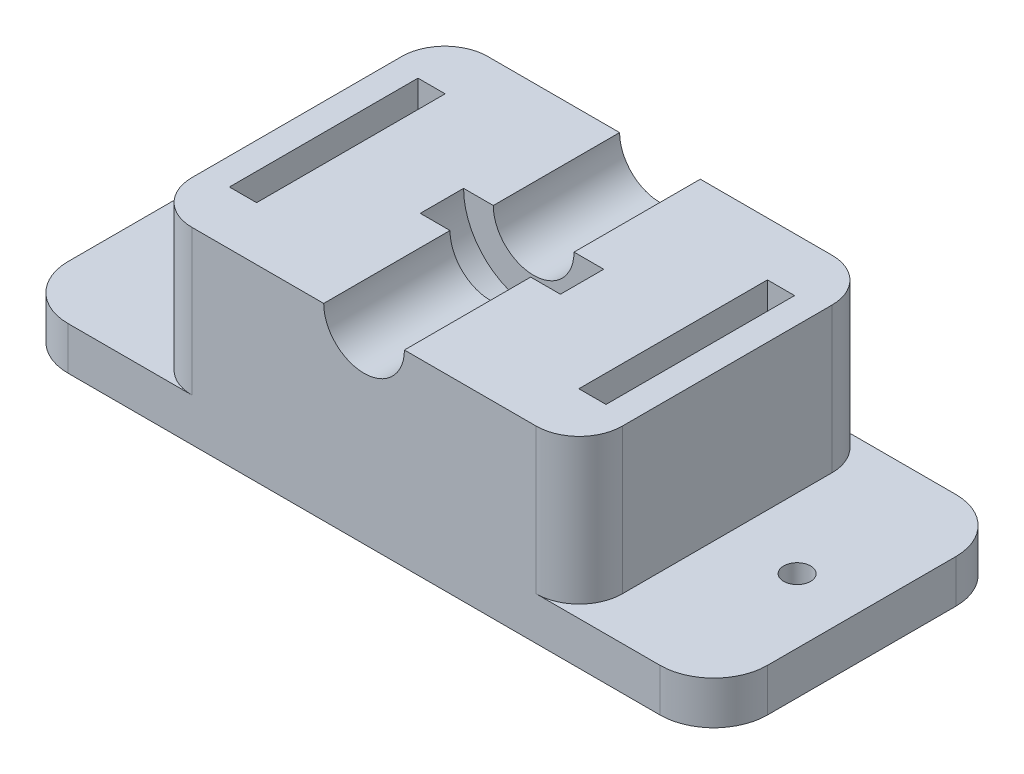
ISO-10303-21;
HEADER;
FILE_DESCRIPTION(('STEP AP214'),'2;1');
FILE_NAME('part.step','',(''),(''),'','','');
FILE_SCHEMA(('AUTOMOTIVE_DESIGN { 1 0 10303 214 1 1 1 1 }'));
ENDSEC;
DATA;
#1=APPLICATION_CONTEXT('core data for automotive mechanical design processes');
#2=APPLICATION_PROTOCOL_DEFINITION('international standard','automotive_design',2000,#1);
#3=PRODUCT_CONTEXT('',#1,'mechanical');
#4=PRODUCT('Part','Part','',(#3));
#5=PRODUCT_RELATED_PRODUCT_CATEGORY('part','',(#4));
#6=PRODUCT_DEFINITION_FORMATION('','',#4);
#7=PRODUCT_DEFINITION_CONTEXT('part definition',#1,'design');
#8=PRODUCT_DEFINITION('design','',#6,#7);
#9=PRODUCT_DEFINITION_SHAPE('','',#8);
#10=(LENGTH_UNIT() NAMED_UNIT(*) SI_UNIT(.MILLI.,.METRE.));
#11=(NAMED_UNIT(*) PLANE_ANGLE_UNIT() SI_UNIT($,.RADIAN.));
#12=(NAMED_UNIT(*) SI_UNIT($,.STERADIAN.) SOLID_ANGLE_UNIT());
#13=UNCERTAINTY_MEASURE_WITH_UNIT(LENGTH_MEASURE(1.E-05),#10,'distance_accuracy_value','');
#14=(GEOMETRIC_REPRESENTATION_CONTEXT(3) GLOBAL_UNCERTAINTY_ASSIGNED_CONTEXT((#13)) GLOBAL_UNIT_ASSIGNED_CONTEXT((#10,
#11,#12)) REPRESENTATION_CONTEXT('',''));
#15=CARTESIAN_POINT('',(0.,0.,0.));
#16=DIRECTION('',(0.,0.,1.));
#17=DIRECTION('',(1.,0.,0.));
#18=AXIS2_PLACEMENT_3D('',#15,#16,#17);
#19=CARTESIAN_POINT('',(-40.,0.,55.));
#20=DIRECTION('',(0.,-1.,0.));
#21=DIRECTION('',(0.,0.,-1.));
#22=AXIS2_PLACEMENT_3D('',#19,#20,#21);
#23=PLANE('',#22);
#24=DIRECTION('',(-1.,0.,0.));
#25=VECTOR('',#24,1.);
#26=CARTESIAN_POINT('',(35.,0.,9.97499999999998));
#27=LINE('',#26,#25);
#28=CARTESIAN_POINT('',(35.,0.,9.97499999999998));
#29=VERTEX_POINT('',#28);
#30=CARTESIAN_POINT('',(29.95,0.,9.97499999999998));
#31=VERTEX_POINT('',#30);
#32=EDGE_CURVE('E352',#29,#31,#27,.T.);
#33=ORIENTED_EDGE('',*,*,#32,.F.);
#34=DIRECTION('',(0.,0.,-1.));
#35=VECTOR('',#34,1.);
#36=CARTESIAN_POINT('',(35.,0.,9.97499999999998));
#37=LINE('',#36,#35);
#38=CARTESIAN_POINT('',(35.,0.,45.025));
#39=VERTEX_POINT('',#38);
#40=EDGE_CURVE('E262',#39,#29,#37,.T.);
#41=ORIENTED_EDGE('',*,*,#40,.F.);
#42=DIRECTION('',(1.,0.,0.));
#43=VECTOR('',#42,1.);
#44=CARTESIAN_POINT('',(35.,0.,45.025));
#45=LINE('',#44,#43);
#46=CARTESIAN_POINT('',(29.95,0.,45.025));
#47=VERTEX_POINT('',#46);
#48=EDGE_CURVE('E337',#47,#39,#45,.T.);
#49=ORIENTED_EDGE('',*,*,#48,.F.);
#50=DIRECTION('',(0.,0.,1.));
#51=VECTOR('',#50,1.);
#52=CARTESIAN_POINT('',(29.95,0.,9.97499999999998));
#53=LINE('',#52,#51);
#54=EDGE_CURVE('E356',#31,#47,#53,.T.);
#55=ORIENTED_EDGE('',*,*,#54,.F.);
#56=EDGE_LOOP('',(#33,#41,#49,#55));
#57=FACE_BOUND('',#56,.T.);
#58=DIRECTION('',(0.,0.,-1.));
#59=VECTOR('',#58,1.);
#60=CARTESIAN_POINT('',(40.,0.,55.));
#61=LINE('',#60,#59);
#62=CARTESIAN_POINT('',(40.,0.,47.));
#63=VERTEX_POINT('',#62);
#64=CARTESIAN_POINT('',(40.,0.,8.));
#65=VERTEX_POINT('',#64);
#66=EDGE_CURVE('E415',#63,#65,#61,.T.);
#67=ORIENTED_EDGE('',*,*,#66,.T.);
#68=CARTESIAN_POINT('',(32.,0.,8.));
#69=DIRECTION('',(0.,-1.,0.));
#70=DIRECTION('',(0.,0.,-1.));
#71=AXIS2_PLACEMENT_3D('',#68,#69,#70);
#72=CIRCLE('',#71,8.);
#73=CARTESIAN_POINT('',(32.,0.,0.));
#74=VERTEX_POINT('',#73);
#75=EDGE_CURVE('E246',#65,#74,#72,.F.);
#76=ORIENTED_EDGE('',*,*,#75,.T.);
#77=DIRECTION('',(-1.,0.,0.));
#78=VECTOR('',#77,1.);
#79=CARTESIAN_POINT('',(-40.,0.,0.));
#80=LINE('',#79,#78);
#81=CARTESIAN_POINT('',(7.5,0.,0.));
#82=VERTEX_POINT('',#81);
#83=EDGE_CURVE('E240',#74,#82,#80,.T.);
#84=ORIENTED_EDGE('',*,*,#83,.T.);
#85=DIRECTION('',(0.,0.,1.));
#86=VECTOR('',#85,1.);
#87=CARTESIAN_POINT('',(7.5,0.,0.));
#88=LINE('',#87,#86);
#89=CARTESIAN_POINT('',(7.5,0.,23.475));
#90=VERTEX_POINT('',#89);
#91=EDGE_CURVE('E244',#82,#90,#88,.T.);
#92=ORIENTED_EDGE('',*,*,#91,.T.);
#93=DIRECTION('',(-1.,0.,0.));
#94=VECTOR('',#93,1.);
#95=CARTESIAN_POINT('',(-40.,0.,23.475));
#96=LINE('',#95,#94);
#97=CARTESIAN_POINT('',(13.025,0.,23.475));
#98=VERTEX_POINT('',#97);
#99=EDGE_CURVE('E448',#98,#90,#96,.T.);
#100=ORIENTED_EDGE('',*,*,#99,.F.);
#101=DIRECTION('',(0.,0.,1.));
#102=VECTOR('',#101,1.);
#103=CARTESIAN_POINT('',(13.025,0.,23.475));
#104=LINE('',#103,#102);
#105=CARTESIAN_POINT('',(13.025,0.,31.525));
#106=VERTEX_POINT('',#105);
#107=EDGE_CURVE('E443',#98,#106,#104,.T.);
#108=ORIENTED_EDGE('',*,*,#107,.T.);
#109=DIRECTION('',(-1.,0.,0.));
#110=VECTOR('',#109,1.);
#111=CARTESIAN_POINT('',(-40.,0.,31.525));
#112=LINE('',#111,#110);
#113=CARTESIAN_POINT('',(7.5,0.,31.525));
#114=VERTEX_POINT('',#113);
#115=EDGE_CURVE('E435',#106,#114,#112,.T.);
#116=ORIENTED_EDGE('',*,*,#115,.T.);
#117=CARTESIAN_POINT('',(7.5,0.,55.));
#118=VERTEX_POINT('',#117);
#119=EDGE_CURVE('E265',#114,#118,#88,.T.);
#120=ORIENTED_EDGE('',*,*,#119,.T.);
#121=DIRECTION('',(-1.,0.,0.));
#122=VECTOR('',#121,1.);
#123=CARTESIAN_POINT('',(-40.,0.,55.));
#124=LINE('',#123,#122);
#125=CARTESIAN_POINT('',(32.,0.,55.));
#126=VERTEX_POINT('',#125);
#127=EDGE_CURVE('E389',#126,#118,#124,.T.);
#128=ORIENTED_EDGE('',*,*,#127,.F.);
#129=CARTESIAN_POINT('',(32.,0.,47.));
#130=DIRECTION('',(0.,-1.,0.));
#131=DIRECTION('',(0.,0.,-1.));
#132=AXIS2_PLACEMENT_3D('',#129,#130,#131);
#133=CIRCLE('',#132,8.);
#134=EDGE_CURVE('E532',#126,#63,#133,.F.);
#135=ORIENTED_EDGE('',*,*,#134,.T.);
#136=EDGE_LOOP('',(#67,#76,#84,#92,#100,#108,#116,#120,#128,#135));
#137=FACE_BOUND('',#136,.T.);
#138=ADVANCED_FACE('F41',(#57,#137),#23,.F.);
#139=DIRECTION('',(1.,0.,0.));
#140=VECTOR('',#139,1.);
#141=CARTESIAN_POINT('',(-35.,0.,45.025));
#142=LINE('',#141,#140);
#143=CARTESIAN_POINT('',(-35.,0.,45.025));
#144=VERTEX_POINT('',#143);
#145=CARTESIAN_POINT('',(-29.95,0.,45.025));
#146=VERTEX_POINT('',#145);
#147=EDGE_CURVE('E307',#144,#146,#142,.T.);
#148=ORIENTED_EDGE('',*,*,#147,.F.);
#149=DIRECTION('',(0.,0.,1.));
#150=VECTOR('',#149,1.);
#151=CARTESIAN_POINT('',(-35.,0.,9.97500000000001));
#152=LINE('',#151,#150);
#153=CARTESIAN_POINT('',(-35.,0.,9.97500000000001));
#154=VERTEX_POINT('',#153);
#155=EDGE_CURVE('E304',#154,#144,#152,.T.);
#156=ORIENTED_EDGE('',*,*,#155,.F.);
#157=DIRECTION('',(-1.,0.,0.));
#158=VECTOR('',#157,1.);
#159=CARTESIAN_POINT('',(-35.,0.,9.97500000000001));
#160=LINE('',#159,#158);
#161=CARTESIAN_POINT('',(-29.95,0.,9.975));
#162=VERTEX_POINT('',#161);
#163=EDGE_CURVE('E291',#162,#154,#160,.T.);
#164=ORIENTED_EDGE('',*,*,#163,.F.);
#165=DIRECTION('',(0.,0.,-1.));
#166=VECTOR('',#165,1.);
#167=CARTESIAN_POINT('',(-29.95,0.,9.975));
#168=LINE('',#167,#166);
#169=EDGE_CURVE('E312',#146,#162,#168,.T.);
#170=ORIENTED_EDGE('',*,*,#169,.F.);
#171=EDGE_LOOP('',(#148,#156,#164,#170));
#172=FACE_BOUND('',#171,.T.);
#173=CARTESIAN_POINT('',(-7.5,0.,0.));
#174=VERTEX_POINT('',#173);
#175=CARTESIAN_POINT('',(-32.,0.,0.));
#176=VERTEX_POINT('',#175);
#177=EDGE_CURVE('E253',#174,#176,#80,.T.);
#178=ORIENTED_EDGE('',*,*,#177,.T.);
#179=CARTESIAN_POINT('',(-32.,0.,8.));
#180=DIRECTION('',(0.,-1.,0.));
#181=DIRECTION('',(0.,0.,-1.));
#182=AXIS2_PLACEMENT_3D('',#179,#180,#181);
#183=CIRCLE('',#182,8.);
#184=CARTESIAN_POINT('',(-40.,0.,8.));
#185=VERTEX_POINT('',#184);
#186=EDGE_CURVE('E522',#176,#185,#183,.F.);
#187=ORIENTED_EDGE('',*,*,#186,.T.);
#188=DIRECTION('',(0.,0.,-1.));
#189=VECTOR('',#188,1.);
#190=CARTESIAN_POINT('',(-40.,0.,55.));
#191=LINE('',#190,#189);
#192=CARTESIAN_POINT('',(-40.,0.,47.));
#193=VERTEX_POINT('',#192);
#194=EDGE_CURVE('E411',#193,#185,#191,.T.);
#195=ORIENTED_EDGE('',*,*,#194,.F.);
#196=CARTESIAN_POINT('',(-32.,0.,47.));
#197=DIRECTION('',(0.,-1.,0.));
#198=DIRECTION('',(0.,0.,-1.));
#199=AXIS2_PLACEMENT_3D('',#196,#197,#198);
#200=CIRCLE('',#199,8.);
#201=CARTESIAN_POINT('',(-32.,0.,55.));
#202=VERTEX_POINT('',#201);
#203=EDGE_CURVE('E519',#193,#202,#200,.F.);
#204=ORIENTED_EDGE('',*,*,#203,.T.);
#205=CARTESIAN_POINT('',(-7.5,0.,55.));
#206=VERTEX_POINT('',#205);
#207=EDGE_CURVE('E388',#206,#202,#124,.T.);
#208=ORIENTED_EDGE('',*,*,#207,.F.);
#209=DIRECTION('',(0.,0.,1.));
#210=VECTOR('',#209,1.);
#211=CARTESIAN_POINT('',(-7.5,0.,0.));
#212=LINE('',#211,#210);
#213=CARTESIAN_POINT('',(-7.5,0.,31.525));
#214=VERTEX_POINT('',#213);
#215=EDGE_CURVE('E270',#206,#214,#212,.F.);
#216=ORIENTED_EDGE('',*,*,#215,.T.);
#217=CARTESIAN_POINT('',(-13.025,0.,31.525));
#218=VERTEX_POINT('',#217);
#219=EDGE_CURVE('E434',#214,#218,#112,.T.);
#220=ORIENTED_EDGE('',*,*,#219,.T.);
#221=DIRECTION('',(0.,0.,1.));
#222=VECTOR('',#221,1.);
#223=CARTESIAN_POINT('',(-13.025,0.,23.475));
#224=LINE('',#223,#222);
#225=CARTESIAN_POINT('',(-13.025,0.,23.475));
#226=VERTEX_POINT('',#225);
#227=EDGE_CURVE('E439',#218,#226,#224,.F.);
#228=ORIENTED_EDGE('',*,*,#227,.T.);
#229=CARTESIAN_POINT('',(-7.5,0.,23.475));
#230=VERTEX_POINT('',#229);
#231=EDGE_CURVE('E447',#230,#226,#96,.T.);
#232=ORIENTED_EDGE('',*,*,#231,.F.);
#233=EDGE_CURVE('E263',#230,#174,#212,.F.);
#234=ORIENTED_EDGE('',*,*,#233,.T.);
#235=EDGE_LOOP('',(#178,#187,#195,#204,#208,#216,#220,#228,#232,#234));
#236=FACE_BOUND('',#235,.T.);
#237=ADVANCED_FACE('F577',(#172,#236),#23,.F.);
#238=CARTESIAN_POINT('',(-65.,-35.,55.));
#239=DIRECTION('',(1.,0.,0.));
#240=DIRECTION('',(0.,0.,-1.));
#241=AXIS2_PLACEMENT_3D('',#238,#239,#240);
#242=PLANE('',#241);
#243=DIRECTION('',(0.,0.,-1.));
#244=VECTOR('',#243,1.);
#245=CARTESIAN_POINT('',(-65.,-27.,55.));
#246=LINE('',#245,#244);
#247=CARTESIAN_POINT('',(-65.,-27.,45.));
#248=VERTEX_POINT('',#247);
#249=CARTESIAN_POINT('',(-65.,-27.,10.));
#250=VERTEX_POINT('',#249);
#251=EDGE_CURVE('E394',#248,#250,#246,.T.);
#252=ORIENTED_EDGE('',*,*,#251,.T.);
#253=DIRECTION('',(0.,-1.,0.));
#254=VECTOR('',#253,1.);
#255=CARTESIAN_POINT('',(-65.,-35.,10.));
#256=LINE('',#255,#254);
#257=CARTESIAN_POINT('',(-65.,-35.,10.));
#258=VERTEX_POINT('',#257);
#259=EDGE_CURVE('E496',#250,#258,#256,.T.);
#260=ORIENTED_EDGE('',*,*,#259,.T.);
#261=DIRECTION('',(0.,0.,-1.));
#262=VECTOR('',#261,1.);
#263=CARTESIAN_POINT('',(-65.,-35.,55.));
#264=LINE('',#263,#262);
#265=CARTESIAN_POINT('',(-65.,-35.,45.));
#266=VERTEX_POINT('',#265);
#267=EDGE_CURVE('E430',#266,#258,#264,.T.);
#268=ORIENTED_EDGE('',*,*,#267,.F.);
#269=DIRECTION('',(0.,-1.,0.));
#270=VECTOR('',#269,1.);
#271=CARTESIAN_POINT('',(-65.,-27.,45.));
#272=LINE('',#271,#270);
#273=EDGE_CURVE('E493',#266,#248,#272,.F.);
#274=ORIENTED_EDGE('',*,*,#273,.T.);
#275=EDGE_LOOP('',(#252,#260,#268,#274));
#276=FACE_BOUND('',#275,.T.);
#277=ADVANCED_FACE('F600',(#276),#242,.F.);
#278=CARTESIAN_POINT('',(40.,-35.,55.));
#279=DIRECTION('',(0.,1.,0.));
#280=DIRECTION('',(0.,0.,1.));
#281=AXIS2_PLACEMENT_3D('',#278,#279,#280);
#282=PLANE('',#281);
#283=CARTESIAN_POINT('',(-53.,-35.,27.5));
#284=DIRECTION('',(0.,1.,0.));
#285=DIRECTION('',(0.,0.,1.));
#286=AXIS2_PLACEMENT_3D('',#283,#284,#285);
#287=CIRCLE('',#286,2.5);
#288=CARTESIAN_POINT('',(-53.,-35.,30.));
#289=VERTEX_POINT('',#288);
#290=EDGE_CURVE('E278',#289,#289,#287,.T.);
#291=ORIENTED_EDGE('',*,*,#290,.T.);
#292=EDGE_LOOP('',(#291));
#293=FACE_BOUND('',#292,.T.);
#294=CARTESIAN_POINT('',(53.,-35.,27.5));
#295=DIRECTION('',(0.,1.,0.));
#296=DIRECTION('',(0.,0.,-1.));
#297=AXIS2_PLACEMENT_3D('',#294,#295,#296);
#298=CIRCLE('',#297,2.5);
#299=CARTESIAN_POINT('',(53.,-35.,25.));
#300=VERTEX_POINT('',#299);
#301=EDGE_CURVE('E702',#300,#300,#298,.T.);
#302=ORIENTED_EDGE('',*,*,#301,.T.);
#303=EDGE_LOOP('',(#302));
#304=FACE_BOUND('',#303,.T.);
#305=DIRECTION('',(1.,0.,0.));
#306=VECTOR('',#305,1.);
#307=CARTESIAN_POINT('',(40.,-35.,0.));
#308=LINE('',#307,#306);
#309=CARTESIAN_POINT('',(-55.,-35.,0.));
#310=VERTEX_POINT('',#309);
#311=CARTESIAN_POINT('',(55.,-35.,0.));
#312=VERTEX_POINT('',#311);
#313=EDGE_CURVE('E378',#310,#312,#308,.T.);
#314=ORIENTED_EDGE('',*,*,#313,.T.);
#315=CARTESIAN_POINT('',(55.,-35.,10.));
#316=DIRECTION('',(0.,1.,0.));
#317=DIRECTION('',(0.,0.,1.));
#318=AXIS2_PLACEMENT_3D('',#315,#316,#317);
#319=CIRCLE('',#318,10.);
#320=CARTESIAN_POINT('',(65.,-35.,10.));
#321=VERTEX_POINT('',#320);
#322=EDGE_CURVE('E483',#312,#321,#319,.F.);
#323=ORIENTED_EDGE('',*,*,#322,.T.);
#324=DIRECTION('',(0.,0.,-1.));
#325=VECTOR('',#324,1.);
#326=CARTESIAN_POINT('',(65.,-35.,55.));
#327=LINE('',#326,#325);
#328=CARTESIAN_POINT('',(65.,-35.,45.));
#329=VERTEX_POINT('',#328);
#330=EDGE_CURVE('E426',#329,#321,#327,.T.);
#331=ORIENTED_EDGE('',*,*,#330,.F.);
#332=CARTESIAN_POINT('',(55.,-35.,45.));
#333=DIRECTION('',(0.,1.,0.));
#334=DIRECTION('',(0.,0.,1.));
#335=AXIS2_PLACEMENT_3D('',#332,#333,#334);
#336=CIRCLE('',#335,10.);
#337=CARTESIAN_POINT('',(55.,-35.,55.));
#338=VERTEX_POINT('',#337);
#339=EDGE_CURVE('E480',#329,#338,#336,.F.);
#340=ORIENTED_EDGE('',*,*,#339,.T.);
#341=DIRECTION('',(1.,0.,0.));
#342=VECTOR('',#341,1.);
#343=CARTESIAN_POINT('',(-40.,-35.,55.));
#344=LINE('',#343,#342);
#345=CARTESIAN_POINT('',(-55.,-35.,55.));
#346=VERTEX_POINT('',#345);
#347=EDGE_CURVE('E382',#346,#338,#344,.T.);
#348=ORIENTED_EDGE('',*,*,#347,.F.);
#349=CARTESIAN_POINT('',(-55.,-35.,45.));
#350=DIRECTION('',(0.,1.,0.));
#351=DIRECTION('',(0.,0.,1.));
#352=AXIS2_PLACEMENT_3D('',#349,#350,#351);
#353=CIRCLE('',#352,10.);
#354=EDGE_CURVE('E474',#346,#266,#353,.F.);
#355=ORIENTED_EDGE('',*,*,#354,.T.);
#356=ORIENTED_EDGE('',*,*,#267,.T.);
#357=CARTESIAN_POINT('',(-55.,-35.,10.));
#358=DIRECTION('',(0.,1.,0.));
#359=DIRECTION('',(0.,0.,1.));
#360=AXIS2_PLACEMENT_3D('',#357,#358,#359);
#361=CIRCLE('',#360,10.);
#362=EDGE_CURVE('E477',#258,#310,#361,.F.);
#363=ORIENTED_EDGE('',*,*,#362,.T.);
#364=EDGE_LOOP('',(#314,#323,#331,#340,#348,#355,#356,#363));
#365=FACE_BOUND('',#364,.T.);
#366=ADVANCED_FACE('F617',(#293,#304,#365),#282,.F.);
#367=CARTESIAN_POINT('',(65.,-35.,55.));
#368=DIRECTION('',(-1.,0.,0.));
#369=DIRECTION('',(0.,-1.,0.));
#370=AXIS2_PLACEMENT_3D('',#367,#368,#369);
#371=PLANE('',#370);
#372=ORIENTED_EDGE('',*,*,#330,.T.);
#373=DIRECTION('',(0.,1.,0.));
#374=VECTOR('',#373,1.);
#375=CARTESIAN_POINT('',(65.,-35.,10.));
#376=LINE('',#375,#374);
#377=CARTESIAN_POINT('',(65.,-27.,10.));
#378=VERTEX_POINT('',#377);
#379=EDGE_CURVE('E458',#321,#378,#376,.T.);
#380=ORIENTED_EDGE('',*,*,#379,.T.);
#381=DIRECTION('',(0.,0.,-1.));
#382=VECTOR('',#381,1.);
#383=CARTESIAN_POINT('',(65.,-27.,55.));
#384=LINE('',#383,#382);
#385=CARTESIAN_POINT('',(65.,-27.,45.));
#386=VERTEX_POINT('',#385);
#387=EDGE_CURVE('E422',#386,#378,#384,.T.);
#388=ORIENTED_EDGE('',*,*,#387,.F.);
#389=DIRECTION('',(0.,1.,0.));
#390=VECTOR('',#389,1.);
#391=CARTESIAN_POINT('',(65.,-35.,45.));
#392=LINE('',#391,#390);
#393=EDGE_CURVE('E455',#386,#329,#392,.F.);
#394=ORIENTED_EDGE('',*,*,#393,.T.);
#395=EDGE_LOOP('',(#372,#380,#388,#394));
#396=FACE_BOUND('',#395,.T.);
#397=ADVANCED_FACE('F613',(#396),#371,.F.);
#398=CARTESIAN_POINT('',(40.,-27.,55.));
#399=DIRECTION('',(0.,-1.,0.));
#400=DIRECTION('',(1.,0.,0.));
#401=AXIS2_PLACEMENT_3D('',#398,#399,#400);
#402=PLANE('',#401);
#403=CARTESIAN_POINT('',(53.,-27.,27.5));
#404=DIRECTION('',(0.,1.,0.));
#405=DIRECTION('',(0.,0.,-1.));
#406=AXIS2_PLACEMENT_3D('',#403,#404,#405);
#407=CIRCLE('',#406,2.5);
#408=CARTESIAN_POINT('',(53.,-27.,25.));
#409=VERTEX_POINT('',#408);
#410=EDGE_CURVE('E709',#409,#409,#407,.T.);
#411=ORIENTED_EDGE('',*,*,#410,.F.);
#412=EDGE_LOOP('',(#411));
#413=FACE_BOUND('',#412,.T.);
#414=ORIENTED_EDGE('',*,*,#387,.T.);
#415=CARTESIAN_POINT('',(55.,-27.,10.));
#416=DIRECTION('',(0.,-1.,0.));
#417=DIRECTION('',(1.,0.,0.));
#418=AXIS2_PLACEMENT_3D('',#415,#416,#417);
#419=CIRCLE('',#418,10.);
#420=CARTESIAN_POINT('',(55.,-27.,0.));
#421=VERTEX_POINT('',#420);
#422=EDGE_CURVE('E465',#378,#421,#419,.F.);
#423=ORIENTED_EDGE('',*,*,#422,.T.);
#424=DIRECTION('',(-1.,0.,0.));
#425=VECTOR('',#424,1.);
#426=CARTESIAN_POINT('',(40.,-27.,0.));
#427=LINE('',#426,#425);
#428=CARTESIAN_POINT('',(32.,-27.,0.));
#429=VERTEX_POINT('',#428);
#430=EDGE_CURVE('E398',#421,#429,#427,.T.);
#431=ORIENTED_EDGE('',*,*,#430,.T.);
#432=CARTESIAN_POINT('',(32.,-27.,8.));
#433=DIRECTION('',(0.,-1.,0.));
#434=DIRECTION('',(1.,0.,0.));
#435=AXIS2_PLACEMENT_3D('',#432,#433,#434);
#436=CIRCLE('',#435,8.);
#437=CARTESIAN_POINT('',(40.,-27.,8.));
#438=VERTEX_POINT('',#437);
#439=EDGE_CURVE('E548',#429,#438,#436,.T.);
#440=ORIENTED_EDGE('',*,*,#439,.T.);
#441=DIRECTION('',(0.,0.,-1.));
#442=VECTOR('',#441,1.);
#443=CARTESIAN_POINT('',(40.,-27.,55.));
#444=LINE('',#443,#442);
#445=CARTESIAN_POINT('',(40.,-27.,47.));
#446=VERTEX_POINT('',#445);
#447=EDGE_CURVE('E418',#446,#438,#444,.T.);
#448=ORIENTED_EDGE('',*,*,#447,.F.);
#449=CARTESIAN_POINT('',(32.,-27.,47.));
#450=DIRECTION('',(0.,-1.,0.));
#451=DIRECTION('',(1.,0.,0.));
#452=AXIS2_PLACEMENT_3D('',#449,#450,#451);
#453=CIRCLE('',#452,8.);
#454=CARTESIAN_POINT('',(32.,-27.,55.));
#455=VERTEX_POINT('',#454);
#456=EDGE_CURVE('E50',#446,#455,#453,.T.);
#457=ORIENTED_EDGE('',*,*,#456,.T.);
#458=DIRECTION('',(-1.,0.,0.));
#459=VECTOR('',#458,1.);
#460=CARTESIAN_POINT('',(40.,-27.,55.));
#461=LINE('',#460,#459);
#462=CARTESIAN_POINT('',(55.,-27.,55.));
#463=VERTEX_POINT('',#462);
#464=EDGE_CURVE('E57',#463,#455,#461,.T.);
#465=ORIENTED_EDGE('',*,*,#464,.F.);
#466=CARTESIAN_POINT('',(55.,-27.,45.));
#467=DIRECTION('',(0.,-1.,0.));
#468=DIRECTION('',(1.,0.,0.));
#469=AXIS2_PLACEMENT_3D('',#466,#467,#468);
#470=CIRCLE('',#469,10.);
#471=EDGE_CURVE('E462',#463,#386,#470,.F.);
#472=ORIENTED_EDGE('',*,*,#471,.T.);
#473=EDGE_LOOP('',(#414,#423,#431,#440,#448,#457,#465,#472));
#474=FACE_BOUND('',#473,.T.);
#475=ADVANCED_FACE('F555',(#413,#474),#402,.F.);
#476=CARTESIAN_POINT('',(40.,0.,55.));
#477=DIRECTION('',(-1.,0.,0.));
#478=DIRECTION('',(0.,-1.,0.));
#479=AXIS2_PLACEMENT_3D('',#476,#477,#478);
#480=PLANE('',#479);
#481=ORIENTED_EDGE('',*,*,#447,.T.);
#482=DIRECTION('',(0.,1.,0.));
#483=VECTOR('',#482,1.);
#484=CARTESIAN_POINT('',(40.,0.,8.));
#485=LINE('',#484,#483);
#486=EDGE_CURVE('E528',#438,#65,#485,.T.);
#487=ORIENTED_EDGE('',*,*,#486,.T.);
#488=ORIENTED_EDGE('',*,*,#66,.F.);
#489=DIRECTION('',(0.,1.,0.));
#490=VECTOR('',#489,1.);
#491=CARTESIAN_POINT('',(40.,-27.,47.));
#492=LINE('',#491,#490);
#493=EDGE_CURVE('E525',#63,#446,#492,.F.);
#494=ORIENTED_EDGE('',*,*,#493,.T.);
#495=EDGE_LOOP('',(#481,#487,#488,#494));
#496=FACE_BOUND('',#495,.T.);
#497=ADVANCED_FACE('F607',(#496),#480,.F.);
#498=CARTESIAN_POINT('',(-40.,-27.,55.));
#499=DIRECTION('',(1.,0.,0.));
#500=DIRECTION('',(0.,0.,-1.));
#501=AXIS2_PLACEMENT_3D('',#498,#499,#500);
#502=PLANE('',#501);
#503=ORIENTED_EDGE('',*,*,#194,.T.);
#504=DIRECTION('',(0.,-1.,0.));
#505=VECTOR('',#504,1.);
#506=CARTESIAN_POINT('',(-40.,-27.,8.));
#507=LINE('',#506,#505);
#508=CARTESIAN_POINT('',(-40.,-27.,8.));
#509=VERTEX_POINT('',#508);
#510=EDGE_CURVE('E509',#185,#509,#507,.T.);
#511=ORIENTED_EDGE('',*,*,#510,.T.);
#512=DIRECTION('',(0.,0.,-1.));
#513=VECTOR('',#512,1.);
#514=CARTESIAN_POINT('',(-40.,-27.,55.));
#515=LINE('',#514,#513);
#516=CARTESIAN_POINT('',(-40.,-27.,47.));
#517=VERTEX_POINT('',#516);
#518=EDGE_CURVE('E407',#517,#509,#515,.T.);
#519=ORIENTED_EDGE('',*,*,#518,.F.);
#520=DIRECTION('',(0.,-1.,0.));
#521=VECTOR('',#520,1.);
#522=CARTESIAN_POINT('',(-40.,0.,47.));
#523=LINE('',#522,#521);
#524=EDGE_CURVE('E506',#517,#193,#523,.F.);
#525=ORIENTED_EDGE('',*,*,#524,.T.);
#526=EDGE_LOOP('',(#503,#511,#519,#525));
#527=FACE_BOUND('',#526,.T.);
#528=ADVANCED_FACE('F605',(#527),#502,.F.);
#529=CARTESIAN_POINT('',(-40.,-27.,55.));
#530=DIRECTION('',(0.,-1.,0.));
#531=DIRECTION('',(0.,0.,-1.));
#532=AXIS2_PLACEMENT_3D('',#529,#530,#531);
#533=PLANE('',#532);
#534=CARTESIAN_POINT('',(-53.,-27.,27.5));
#535=DIRECTION('',(0.,1.,0.));
#536=DIRECTION('',(0.,0.,1.));
#537=AXIS2_PLACEMENT_3D('',#534,#535,#536);
#538=CIRCLE('',#537,2.5);
#539=CARTESIAN_POINT('',(-53.,-27.,30.));
#540=VERTEX_POINT('',#539);
#541=EDGE_CURVE('E699',#540,#540,#538,.T.);
#542=ORIENTED_EDGE('',*,*,#541,.F.);
#543=EDGE_LOOP('',(#542));
#544=FACE_BOUND('',#543,.T.);
#545=DIRECTION('',(-1.,0.,0.));
#546=VECTOR('',#545,1.);
#547=CARTESIAN_POINT('',(-40.,-27.,0.));
#548=LINE('',#547,#546);
#549=CARTESIAN_POINT('',(-32.,-27.,0.));
#550=VERTEX_POINT('',#549);
#551=CARTESIAN_POINT('',(-55.,-27.,0.));
#552=VERTEX_POINT('',#551);
#553=EDGE_CURVE('E252',#550,#552,#548,.T.);
#554=ORIENTED_EDGE('',*,*,#553,.T.);
#555=CARTESIAN_POINT('',(-55.,-27.,10.));
#556=DIRECTION('',(0.,-1.,0.));
#557=DIRECTION('',(0.,0.,-1.));
#558=AXIS2_PLACEMENT_3D('',#555,#556,#557);
#559=CIRCLE('',#558,10.);
#560=EDGE_CURVE('E503',#552,#250,#559,.F.);
#561=ORIENTED_EDGE('',*,*,#560,.T.);
#562=ORIENTED_EDGE('',*,*,#251,.F.);
#563=CARTESIAN_POINT('',(-55.,-27.,45.));
#564=DIRECTION('',(0.,-1.,0.));
#565=DIRECTION('',(0.,0.,-1.));
#566=AXIS2_PLACEMENT_3D('',#563,#564,#565);
#567=CIRCLE('',#566,10.);
#568=CARTESIAN_POINT('',(-55.,-27.,55.));
#569=VERTEX_POINT('',#568);
#570=EDGE_CURVE('E500',#248,#569,#567,.F.);
#571=ORIENTED_EDGE('',*,*,#570,.T.);
#572=DIRECTION('',(-1.,0.,0.));
#573=VECTOR('',#572,1.);
#574=CARTESIAN_POINT('',(-40.,-27.,55.));
#575=LINE('',#574,#573);
#576=CARTESIAN_POINT('',(-32.,-27.,55.));
#577=VERTEX_POINT('',#576);
#578=EDGE_CURVE('E64',#577,#569,#575,.T.);
#579=ORIENTED_EDGE('',*,*,#578,.F.);
#580=CARTESIAN_POINT('',(-32.,-27.,47.));
#581=DIRECTION('',(0.,-1.,0.));
#582=DIRECTION('',(0.,0.,-1.));
#583=AXIS2_PLACEMENT_3D('',#580,#581,#582);
#584=CIRCLE('',#583,8.);
#585=EDGE_CURVE('E11',#577,#517,#584,.T.);
#586=ORIENTED_EDGE('',*,*,#585,.T.);
#587=ORIENTED_EDGE('',*,*,#518,.T.);
#588=CARTESIAN_POINT('',(-32.,-27.,8.));
#589=DIRECTION('',(0.,-1.,0.));
#590=DIRECTION('',(0.,0.,-1.));
#591=AXIS2_PLACEMENT_3D('',#588,#589,#590);
#592=CIRCLE('',#591,8.);
#593=EDGE_CURVE('E544',#509,#550,#592,.T.);
#594=ORIENTED_EDGE('',*,*,#593,.T.);
#595=EDGE_LOOP('',(#554,#561,#562,#571,#579,#586,#587,#594));
#596=FACE_BOUND('',#595,.T.);
#597=ADVANCED_FACE('F684',(#544,#596),#533,.F.);
#598=CARTESIAN_POINT('',(0.,0.,55.));
#599=DIRECTION('',(0.,0.,1.));
#600=DIRECTION('',(1.,0.,0.));
#601=AXIS2_PLACEMENT_3D('',#598,#599,#600);
#602=PLANE('',#601);
#603=ORIENTED_EDGE('',*,*,#464,.T.);
#604=DIRECTION('',(0.,1.,0.));
#605=VECTOR('',#604,1.);
#606=CARTESIAN_POINT('',(32.,0.,55.));
#607=LINE('',#606,#605);
#608=EDGE_CURVE('E541',#455,#126,#607,.T.);
#609=ORIENTED_EDGE('',*,*,#608,.T.);
#610=ORIENTED_EDGE('',*,*,#127,.T.);
#611=CARTESIAN_POINT('',(0.,0.,55.));
#612=DIRECTION('',(0.,0.,1.));
#613=DIRECTION('',(1.,0.,0.));
#614=AXIS2_PLACEMENT_3D('',#611,#612,#613);
#615=CIRCLE('',#614,7.5);
#616=EDGE_CURVE('E271',#206,#118,#615,.T.);
#617=ORIENTED_EDGE('',*,*,#616,.F.);
#618=ORIENTED_EDGE('',*,*,#207,.T.);
#619=DIRECTION('',(0.,-1.,0.));
#620=VECTOR('',#619,1.);
#621=CARTESIAN_POINT('',(-32.,-27.,55.));
#622=LINE('',#621,#620);
#623=EDGE_CURVE('E537',#202,#577,#622,.T.);
#624=ORIENTED_EDGE('',*,*,#623,.T.);
#625=ORIENTED_EDGE('',*,*,#578,.T.);
#626=DIRECTION('',(0.,-1.,0.));
#627=VECTOR('',#626,1.);
#628=CARTESIAN_POINT('',(-55.,-35.,55.));
#629=LINE('',#628,#627);
#630=EDGE_CURVE('E486',#569,#346,#629,.T.);
#631=ORIENTED_EDGE('',*,*,#630,.T.);
#632=ORIENTED_EDGE('',*,*,#347,.T.);
#633=DIRECTION('',(0.,1.,0.));
#634=VECTOR('',#633,1.);
#635=CARTESIAN_POINT('',(55.,-27.,55.));
#636=LINE('',#635,#634);
#637=EDGE_CURVE('E490',#338,#463,#636,.T.);
#638=ORIENTED_EDGE('',*,*,#637,.T.);
#639=EDGE_LOOP('',(#603,#609,#610,#617,#618,#624,#625,#631,#632,#638));
#640=FACE_BOUND('',#639,.T.);
#641=ADVANCED_FACE('F560',(#640),#602,.T.);
#642=CARTESIAN_POINT('',(0.,0.,0.));
#643=DIRECTION('',(0.,0.,1.));
#644=DIRECTION('',(1.,0.,0.));
#645=AXIS2_PLACEMENT_3D('',#642,#643,#644);
#646=PLANE('',#645);
#647=ORIENTED_EDGE('',*,*,#553,.F.);
#648=DIRECTION('',(0.,-1.,0.));
#649=VECTOR('',#648,1.);
#650=CARTESIAN_POINT('',(-32.,0.,0.));
#651=LINE('',#650,#649);
#652=EDGE_CURVE('E516',#550,#176,#651,.F.);
#653=ORIENTED_EDGE('',*,*,#652,.T.);
#654=ORIENTED_EDGE('',*,*,#177,.F.);
#655=CARTESIAN_POINT('',(0.,0.,0.));
#656=DIRECTION('',(0.,0.,1.));
#657=DIRECTION('',(1.,0.,0.));
#658=AXIS2_PLACEMENT_3D('',#655,#656,#657);
#659=CIRCLE('',#658,7.5);
#660=EDGE_CURVE('E257',#174,#82,#659,.T.);
#661=ORIENTED_EDGE('',*,*,#660,.T.);
#662=ORIENTED_EDGE('',*,*,#83,.F.);
#663=DIRECTION('',(0.,1.,0.));
#664=VECTOR('',#663,1.);
#665=CARTESIAN_POINT('',(32.,0.,0.));
#666=LINE('',#665,#664);
#667=EDGE_CURVE('E513',#74,#429,#666,.F.);
#668=ORIENTED_EDGE('',*,*,#667,.T.);
#669=ORIENTED_EDGE('',*,*,#430,.F.);
#670=DIRECTION('',(0.,1.,0.));
#671=VECTOR('',#670,1.);
#672=CARTESIAN_POINT('',(55.0000000000001,0.,0.));
#673=LINE('',#672,#671);
#674=EDGE_CURVE('E471',#421,#312,#673,.F.);
#675=ORIENTED_EDGE('',*,*,#674,.T.);
#676=ORIENTED_EDGE('',*,*,#313,.F.);
#677=DIRECTION('',(0.,-1.,0.));
#678=VECTOR('',#677,1.);
#679=CARTESIAN_POINT('',(-55.,0.,0.));
#680=LINE('',#679,#678);
#681=EDGE_CURVE('E468',#310,#552,#680,.F.);
#682=ORIENTED_EDGE('',*,*,#681,.T.);
#683=EDGE_LOOP('',(#647,#653,#654,#661,#662,#668,#669,#675,#676,#682));
#684=FACE_BOUND('',#683,.T.);
#685=ADVANCED_FACE('F267',(#684),#646,.F.);
#686=CARTESIAN_POINT('',(0.,0.,23.475));
#687=DIRECTION('',(0.,0.,1.));
#688=DIRECTION('',(1.,0.,0.));
#689=AXIS2_PLACEMENT_3D('',#686,#687,#688);
#690=CYLINDRICAL_SURFACE('',#689,13.025);
#691=CARTESIAN_POINT('',(0.,0.,23.475));
#692=DIRECTION('',(0.,0.,1.));
#693=DIRECTION('',(1.,0.,0.));
#694=AXIS2_PLACEMENT_3D('',#691,#692,#693);
#695=CIRCLE('',#694,13.025);
#696=EDGE_CURVE('E374',#226,#98,#695,.T.);
#697=ORIENTED_EDGE('',*,*,#696,.F.);
#698=ORIENTED_EDGE('',*,*,#227,.F.);
#699=CARTESIAN_POINT('',(0.,0.,31.525));
#700=DIRECTION('',(0.,0.,1.));
#701=DIRECTION('',(1.,0.,0.));
#702=AXIS2_PLACEMENT_3D('',#699,#700,#701);
#703=CIRCLE('',#702,13.025);
#704=EDGE_CURVE('E322',#218,#106,#703,.T.);
#705=ORIENTED_EDGE('',*,*,#704,.T.);
#706=ORIENTED_EDGE('',*,*,#107,.F.);
#707=EDGE_LOOP('',(#697,#698,#705,#706));
#708=FACE_BOUND('',#707,.T.);
#709=ADVANCED_FACE('F583',(#708),#690,.F.);
#710=CARTESIAN_POINT('',(0.,0.,23.475));
#711=DIRECTION('',(0.,0.,1.));
#712=DIRECTION('',(1.,0.,0.));
#713=AXIS2_PLACEMENT_3D('',#710,#711,#712);
#714=PLANE('',#713);
#715=CARTESIAN_POINT('',(0.,0.,23.475));
#716=DIRECTION('',(0.,0.,1.));
#717=DIRECTION('',(1.,0.,0.));
#718=AXIS2_PLACEMENT_3D('',#715,#716,#717);
#719=CIRCLE('',#718,7.5);
#720=EDGE_CURVE('E260',#230,#90,#719,.T.);
#721=ORIENTED_EDGE('',*,*,#720,.F.);
#722=ORIENTED_EDGE('',*,*,#231,.T.);
#723=ORIENTED_EDGE('',*,*,#696,.T.);
#724=ORIENTED_EDGE('',*,*,#99,.T.);
#725=EDGE_LOOP('',(#721,#722,#723,#724));
#726=FACE_BOUND('',#725,.T.);
#727=ADVANCED_FACE('F580',(#726),#714,.T.);
#728=CARTESIAN_POINT('',(0.,0.,31.525));
#729=DIRECTION('',(0.,0.,1.));
#730=DIRECTION('',(1.,0.,0.));
#731=AXIS2_PLACEMENT_3D('',#728,#729,#730);
#732=PLANE('',#731);
#733=ORIENTED_EDGE('',*,*,#219,.F.);
#734=CARTESIAN_POINT('',(0.,0.,31.525));
#735=DIRECTION('',(0.,0.,1.));
#736=DIRECTION('',(1.,0.,0.));
#737=AXIS2_PLACEMENT_3D('',#734,#735,#736);
#738=CIRCLE('',#737,7.5);
#739=EDGE_CURVE('E451',#214,#114,#738,.T.);
#740=ORIENTED_EDGE('',*,*,#739,.T.);
#741=ORIENTED_EDGE('',*,*,#115,.F.);
#742=ORIENTED_EDGE('',*,*,#704,.F.);
#743=EDGE_LOOP('',(#733,#740,#741,#742));
#744=FACE_BOUND('',#743,.T.);
#745=ADVANCED_FACE('F567',(#744),#732,.F.);
#746=CARTESIAN_POINT('',(35.,-10.,9.97499999999998));
#747=DIRECTION('',(1.,0.,0.));
#748=DIRECTION('',(0.,0.,-1.));
#749=AXIS2_PLACEMENT_3D('',#746,#747,#748);
#750=PLANE('',#749);
#751=ORIENTED_EDGE('',*,*,#40,.T.);
#752=DIRECTION('',(0.,1.,0.));
#753=VECTOR('',#752,1.);
#754=CARTESIAN_POINT('',(35.,-10.,9.97499999999998));
#755=LINE('',#754,#753);
#756=CARTESIAN_POINT('',(35.,-10.,9.97499999999998));
#757=VERTEX_POINT('',#756);
#758=EDGE_CURVE('E349',#757,#29,#755,.T.);
#759=ORIENTED_EDGE('',*,*,#758,.F.);
#760=DIRECTION('',(0.,0.,-1.));
#761=VECTOR('',#760,1.);
#762=CARTESIAN_POINT('',(35.,-10.,9.97499999999998));
#763=LINE('',#762,#761);
#764=CARTESIAN_POINT('',(35.,-10.,45.025));
#765=VERTEX_POINT('',#764);
#766=EDGE_CURVE('E332',#765,#757,#763,.T.);
#767=ORIENTED_EDGE('',*,*,#766,.F.);
#768=DIRECTION('',(0.,1.,0.));
#769=VECTOR('',#768,1.);
#770=CARTESIAN_POINT('',(35.,-10.,45.025));
#771=LINE('',#770,#769);
#772=EDGE_CURVE('E308',#765,#39,#771,.T.);
#773=ORIENTED_EDGE('',*,*,#772,.T.);
#774=EDGE_LOOP('',(#751,#759,#767,#773));
#775=FACE_BOUND('',#774,.T.);
#776=ADVANCED_FACE('F756',(#775),#750,.F.);
#777=CARTESIAN_POINT('',(35.,-10.,45.025));
#778=DIRECTION('',(0.,0.,1.));
#779=DIRECTION('',(1.,0.,0.));
#780=AXIS2_PLACEMENT_3D('',#777,#778,#779);
#781=PLANE('',#780);
#782=ORIENTED_EDGE('',*,*,#48,.T.);
#783=ORIENTED_EDGE('',*,*,#772,.F.);
#784=DIRECTION('',(1.,0.,0.));
#785=VECTOR('',#784,1.);
#786=CARTESIAN_POINT('',(35.,-10.,45.025));
#787=LINE('',#786,#785);
#788=CARTESIAN_POINT('',(29.95,-10.,45.025));
#789=VERTEX_POINT('',#788);
#790=EDGE_CURVE('E345',#789,#765,#787,.T.);
#791=ORIENTED_EDGE('',*,*,#790,.F.);
#792=DIRECTION('',(0.,1.,0.));
#793=VECTOR('',#792,1.);
#794=CARTESIAN_POINT('',(29.95,-10.,45.025));
#795=LINE('',#794,#793);
#796=EDGE_CURVE('E365',#789,#47,#795,.T.);
#797=ORIENTED_EDGE('',*,*,#796,.T.);
#798=EDGE_LOOP('',(#782,#783,#791,#797));
#799=FACE_BOUND('',#798,.T.);
#800=ADVANCED_FACE('F752',(#799),#781,.F.);
#801=CARTESIAN_POINT('',(29.95,-10.,9.97499999999998));
#802=DIRECTION('',(-1.,0.,0.));
#803=DIRECTION('',(0.,0.,1.));
#804=AXIS2_PLACEMENT_3D('',#801,#802,#803);
#805=PLANE('',#804);
#806=ORIENTED_EDGE('',*,*,#54,.T.);
#807=ORIENTED_EDGE('',*,*,#796,.F.);
#808=DIRECTION('',(0.,0.,1.));
#809=VECTOR('',#808,1.);
#810=CARTESIAN_POINT('',(29.95,-10.,9.97499999999998));
#811=LINE('',#810,#809);
#812=CARTESIAN_POINT('',(29.95,-10.,9.97499999999998));
#813=VERTEX_POINT('',#812);
#814=EDGE_CURVE('E341',#813,#789,#811,.T.);
#815=ORIENTED_EDGE('',*,*,#814,.F.);
#816=DIRECTION('',(0.,1.,0.));
#817=VECTOR('',#816,1.);
#818=CARTESIAN_POINT('',(29.95,-10.,9.97499999999998));
#819=LINE('',#818,#817);
#820=EDGE_CURVE('E368',#813,#31,#819,.T.);
#821=ORIENTED_EDGE('',*,*,#820,.T.);
#822=EDGE_LOOP('',(#806,#807,#815,#821));
#823=FACE_BOUND('',#822,.T.);
#824=ADVANCED_FACE('F755',(#823),#805,.F.);
#825=CARTESIAN_POINT('',(35.,-10.,9.97499999999998));
#826=DIRECTION('',(0.,0.,-1.));
#827=DIRECTION('',(-1.,0.,0.));
#828=AXIS2_PLACEMENT_3D('',#825,#826,#827);
#829=PLANE('',#828);
#830=ORIENTED_EDGE('',*,*,#32,.T.);
#831=ORIENTED_EDGE('',*,*,#820,.F.);
#832=DIRECTION('',(-1.,0.,0.));
#833=VECTOR('',#832,1.);
#834=CARTESIAN_POINT('',(35.,-10.,9.97499999999998));
#835=LINE('',#834,#833);
#836=EDGE_CURVE('E336',#757,#813,#835,.T.);
#837=ORIENTED_EDGE('',*,*,#836,.F.);
#838=ORIENTED_EDGE('',*,*,#758,.T.);
#839=EDGE_LOOP('',(#830,#831,#837,#838));
#840=FACE_BOUND('',#839,.T.);
#841=ADVANCED_FACE('F750',(#840),#829,.F.);
#842=CARTESIAN_POINT('',(0.,-10.,0.));
#843=DIRECTION('',(0.,-1.,0.));
#844=DIRECTION('',(0.,0.,-1.));
#845=AXIS2_PLACEMENT_3D('',#842,#843,#844);
#846=PLANE('',#845);
#847=ORIENTED_EDGE('',*,*,#766,.T.);
#848=ORIENTED_EDGE('',*,*,#836,.T.);
#849=ORIENTED_EDGE('',*,*,#814,.T.);
#850=ORIENTED_EDGE('',*,*,#790,.T.);
#851=EDGE_LOOP('',(#847,#848,#849,#850));
#852=FACE_BOUND('',#851,.T.);
#853=ADVANCED_FACE('F746',(#852),#846,.F.);
#854=CARTESIAN_POINT('',(-35.,-10.,9.97500000000001));
#855=DIRECTION('',(-1.,0.,0.));
#856=DIRECTION('',(0.,0.,1.));
#857=AXIS2_PLACEMENT_3D('',#854,#855,#856);
#858=PLANE('',#857);
#859=ORIENTED_EDGE('',*,*,#155,.T.);
#860=DIRECTION('',(0.,1.,0.));
#861=VECTOR('',#860,1.);
#862=CARTESIAN_POINT('',(-35.,-10.,45.025));
#863=LINE('',#862,#861);
#864=CARTESIAN_POINT('',(-35.,-10.,45.025));
#865=VERTEX_POINT('',#864);
#866=EDGE_CURVE('E303',#865,#144,#863,.T.);
#867=ORIENTED_EDGE('',*,*,#866,.F.);
#868=DIRECTION('',(0.,0.,1.));
#869=VECTOR('',#868,1.);
#870=CARTESIAN_POINT('',(-35.,-10.,9.97500000000001));
#871=LINE('',#870,#869);
#872=CARTESIAN_POINT('',(-35.,-10.,9.97500000000001));
#873=VERTEX_POINT('',#872);
#874=EDGE_CURVE('E286',#873,#865,#871,.T.);
#875=ORIENTED_EDGE('',*,*,#874,.F.);
#876=DIRECTION('',(0.,1.,0.));
#877=VECTOR('',#876,1.);
#878=CARTESIAN_POINT('',(-35.,-10.,9.97500000000001));
#879=LINE('',#878,#877);
#880=EDGE_CURVE('E319',#873,#154,#879,.T.);
#881=ORIENTED_EDGE('',*,*,#880,.T.);
#882=EDGE_LOOP('',(#859,#867,#875,#881));
#883=FACE_BOUND('',#882,.T.);
#884=ADVANCED_FACE('F736',(#883),#858,.F.);
#885=CARTESIAN_POINT('',(-35.,-10.,9.97500000000001));
#886=DIRECTION('',(0.,0.,-1.));
#887=DIRECTION('',(-1.,0.,0.));
#888=AXIS2_PLACEMENT_3D('',#885,#886,#887);
#889=PLANE('',#888);
#890=ORIENTED_EDGE('',*,*,#163,.T.);
#891=ORIENTED_EDGE('',*,*,#880,.F.);
#892=DIRECTION('',(-1.,0.,0.));
#893=VECTOR('',#892,1.);
#894=CARTESIAN_POINT('',(-35.,-10.,9.97500000000001));
#895=LINE('',#894,#893);
#896=CARTESIAN_POINT('',(-29.95,-10.,9.975));
#897=VERTEX_POINT('',#896);
#898=EDGE_CURVE('E299',#897,#873,#895,.T.);
#899=ORIENTED_EDGE('',*,*,#898,.F.);
#900=DIRECTION('',(0.,1.,0.));
#901=VECTOR('',#900,1.);
#902=CARTESIAN_POINT('',(-29.95,-10.,9.975));
#903=LINE('',#902,#901);
#904=EDGE_CURVE('E323',#897,#162,#903,.T.);
#905=ORIENTED_EDGE('',*,*,#904,.T.);
#906=EDGE_LOOP('',(#890,#891,#899,#905));
#907=FACE_BOUND('',#906,.T.);
#908=ADVANCED_FACE('F732',(#907),#889,.F.);
#909=CARTESIAN_POINT('',(-29.95,-10.,9.975));
#910=DIRECTION('',(1.,0.,0.));
#911=DIRECTION('',(0.,0.,-1.));
#912=AXIS2_PLACEMENT_3D('',#909,#910,#911);
#913=PLANE('',#912);
#914=ORIENTED_EDGE('',*,*,#169,.T.);
#915=ORIENTED_EDGE('',*,*,#904,.F.);
#916=DIRECTION('',(0.,0.,-1.));
#917=VECTOR('',#916,1.);
#918=CARTESIAN_POINT('',(-29.95,-10.,9.975));
#919=LINE('',#918,#917);
#920=CARTESIAN_POINT('',(-29.95,-10.,45.025));
#921=VERTEX_POINT('',#920);
#922=EDGE_CURVE('E295',#921,#897,#919,.T.);
#923=ORIENTED_EDGE('',*,*,#922,.F.);
#924=DIRECTION('',(0.,1.,0.));
#925=VECTOR('',#924,1.);
#926=CARTESIAN_POINT('',(-29.95,-10.,45.025));
#927=LINE('',#926,#925);
#928=EDGE_CURVE('E326',#921,#146,#927,.T.);
#929=ORIENTED_EDGE('',*,*,#928,.T.);
#930=EDGE_LOOP('',(#914,#915,#923,#929));
#931=FACE_BOUND('',#930,.T.);
#932=ADVANCED_FACE('F735',(#931),#913,.F.);
#933=CARTESIAN_POINT('',(-35.,-10.,45.025));
#934=DIRECTION('',(0.,0.,1.));
#935=DIRECTION('',(1.,0.,0.));
#936=AXIS2_PLACEMENT_3D('',#933,#934,#935);
#937=PLANE('',#936);
#938=ORIENTED_EDGE('',*,*,#147,.T.);
#939=ORIENTED_EDGE('',*,*,#928,.F.);
#940=DIRECTION('',(1.,0.,0.));
#941=VECTOR('',#940,1.);
#942=CARTESIAN_POINT('',(-35.,-10.,45.025));
#943=LINE('',#942,#941);
#944=EDGE_CURVE('E290',#865,#921,#943,.T.);
#945=ORIENTED_EDGE('',*,*,#944,.F.);
#946=ORIENTED_EDGE('',*,*,#866,.T.);
#947=EDGE_LOOP('',(#938,#939,#945,#946));
#948=FACE_BOUND('',#947,.T.);
#949=ADVANCED_FACE('F730',(#948),#937,.F.);
#950=CARTESIAN_POINT('',(0.,-10.,0.));
#951=DIRECTION('',(0.,1.,0.));
#952=DIRECTION('',(0.,0.,1.));
#953=AXIS2_PLACEMENT_3D('',#950,#951,#952);
#954=PLANE('',#953);
#955=ORIENTED_EDGE('',*,*,#874,.T.);
#956=ORIENTED_EDGE('',*,*,#944,.T.);
#957=ORIENTED_EDGE('',*,*,#922,.T.);
#958=ORIENTED_EDGE('',*,*,#898,.T.);
#959=EDGE_LOOP('',(#955,#956,#957,#958));
#960=FACE_BOUND('',#959,.T.);
#961=ADVANCED_FACE('F727',(#960),#954,.T.);
#962=CARTESIAN_POINT('',(0.,0.,0.));
#963=DIRECTION('',(0.,0.,1.));
#964=DIRECTION('',(1.,0.,0.));
#965=AXIS2_PLACEMENT_3D('',#962,#963,#964);
#966=CYLINDRICAL_SURFACE('',#965,7.5);
#967=ORIENTED_EDGE('',*,*,#739,.F.);
#968=ORIENTED_EDGE('',*,*,#215,.F.);
#969=ORIENTED_EDGE('',*,*,#616,.T.);
#970=ORIENTED_EDGE('',*,*,#119,.F.);
#971=EDGE_LOOP('',(#967,#968,#969,#970));
#972=FACE_BOUND('',#971,.T.);
#973=ADVANCED_FACE('F564',(#972),#966,.F.);
#974=ORIENTED_EDGE('',*,*,#660,.F.);
#975=ORIENTED_EDGE('',*,*,#233,.F.);
#976=ORIENTED_EDGE('',*,*,#720,.T.);
#977=ORIENTED_EDGE('',*,*,#91,.F.);
#978=EDGE_LOOP('',(#974,#975,#976,#977));
#979=FACE_BOUND('',#978,.T.);
#980=ADVANCED_FACE('F256',(#979),#966,.F.);
#981=CARTESIAN_POINT('',(55.,-35.,10.));
#982=DIRECTION('',(0.,1.,0.));
#983=DIRECTION('',(-1.,0.,0.));
#984=AXIS2_PLACEMENT_3D('',#981,#982,#983);
#985=CYLINDRICAL_SURFACE('',#984,10.);
#986=ORIENTED_EDGE('',*,*,#322,.F.);
#987=ORIENTED_EDGE('',*,*,#674,.F.);
#988=ORIENTED_EDGE('',*,*,#422,.F.);
#989=ORIENTED_EDGE('',*,*,#379,.F.);
#990=EDGE_LOOP('',(#986,#987,#988,#989));
#991=FACE_BOUND('',#990,.T.);
#992=ADVANCED_FACE('F625',(#991),#985,.T.);
#993=CARTESIAN_POINT('',(55.0000000000001,0.,45.));
#994=DIRECTION('',(0.,-1.,0.));
#995=DIRECTION('',(1.,0.,0.));
#996=AXIS2_PLACEMENT_3D('',#993,#994,#995);
#997=CYLINDRICAL_SURFACE('',#996,10.);
#998=ORIENTED_EDGE('',*,*,#339,.F.);
#999=ORIENTED_EDGE('',*,*,#393,.F.);
#1000=ORIENTED_EDGE('',*,*,#471,.F.);
#1001=ORIENTED_EDGE('',*,*,#637,.F.);
#1002=EDGE_LOOP('',(#998,#999,#1000,#1001));
#1003=FACE_BOUND('',#1002,.T.);
#1004=ADVANCED_FACE('F628',(#1003),#997,.T.);
#1005=CARTESIAN_POINT('',(-55.,-35.,10.));
#1006=DIRECTION('',(0.,-1.,0.));
#1007=DIRECTION('',(0.,0.,-1.));
#1008=AXIS2_PLACEMENT_3D('',#1005,#1006,#1007);
#1009=CYLINDRICAL_SURFACE('',#1008,10.);
#1010=ORIENTED_EDGE('',*,*,#560,.F.);
#1011=ORIENTED_EDGE('',*,*,#681,.F.);
#1012=ORIENTED_EDGE('',*,*,#362,.F.);
#1013=ORIENTED_EDGE('',*,*,#259,.F.);
#1014=EDGE_LOOP('',(#1010,#1011,#1012,#1013));
#1015=FACE_BOUND('',#1014,.T.);
#1016=ADVANCED_FACE('F632',(#1015),#1009,.T.);
#1017=CARTESIAN_POINT('',(-55.,0.,45.));
#1018=DIRECTION('',(0.,1.,0.));
#1019=DIRECTION('',(0.,0.,1.));
#1020=AXIS2_PLACEMENT_3D('',#1017,#1018,#1019);
#1021=CYLINDRICAL_SURFACE('',#1020,10.);
#1022=ORIENTED_EDGE('',*,*,#570,.F.);
#1023=ORIENTED_EDGE('',*,*,#273,.F.);
#1024=ORIENTED_EDGE('',*,*,#354,.F.);
#1025=ORIENTED_EDGE('',*,*,#630,.F.);
#1026=EDGE_LOOP('',(#1022,#1023,#1024,#1025));
#1027=FACE_BOUND('',#1026,.T.);
#1028=ADVANCED_FACE('F636',(#1027),#1021,.T.);
#1029=CARTESIAN_POINT('',(-53.,-35.,27.5));
#1030=DIRECTION('',(0.,1.,0.));
#1031=DIRECTION('',(0.,0.,1.));
#1032=AXIS2_PLACEMENT_3D('',#1029,#1030,#1031);
#1033=CYLINDRICAL_SURFACE('',#1032,2.5);
#1034=ORIENTED_EDGE('',*,*,#290,.F.);
#1035=EDGE_LOOP('',(#1034));
#1036=FACE_BOUND('',#1035,.T.);
#1037=ORIENTED_EDGE('',*,*,#541,.T.);
#1038=EDGE_LOOP('',(#1037));
#1039=FACE_BOUND('',#1038,.T.);
#1040=ADVANCED_FACE('F640',(#1036,#1039),#1033,.F.);
#1041=CARTESIAN_POINT('',(53.,-35.,27.5));
#1042=DIRECTION('',(0.,1.,0.));
#1043=DIRECTION('',(0.,0.,1.));
#1044=AXIS2_PLACEMENT_3D('',#1041,#1042,#1043);
#1045=CYLINDRICAL_SURFACE('',#1044,2.5);
#1046=ORIENTED_EDGE('',*,*,#301,.F.);
#1047=EDGE_LOOP('',(#1046));
#1048=FACE_BOUND('',#1047,.T.);
#1049=ORIENTED_EDGE('',*,*,#410,.T.);
#1050=EDGE_LOOP('',(#1049));
#1051=FACE_BOUND('',#1050,.T.);
#1052=ADVANCED_FACE('F646',(#1048,#1051),#1045,.F.);
#1053=CARTESIAN_POINT('',(-32.,-27.,8.));
#1054=DIRECTION('',(0.,-1.,0.));
#1055=DIRECTION('',(0.,0.,-1.));
#1056=AXIS2_PLACEMENT_3D('',#1053,#1054,#1055);
#1057=CYLINDRICAL_SURFACE('',#1056,8.);
#1058=ORIENTED_EDGE('',*,*,#186,.F.);
#1059=ORIENTED_EDGE('',*,*,#652,.F.);
#1060=ORIENTED_EDGE('',*,*,#593,.F.);
#1061=ORIENTED_EDGE('',*,*,#510,.F.);
#1062=EDGE_LOOP('',(#1058,#1059,#1060,#1061));
#1063=FACE_BOUND('',#1062,.T.);
#1064=ADVANCED_FACE('F642',(#1063),#1057,.T.);
#1065=CARTESIAN_POINT('',(32.,0.,8.));
#1066=DIRECTION('',(0.,1.,0.));
#1067=DIRECTION('',(-1.,0.,0.));
#1068=AXIS2_PLACEMENT_3D('',#1065,#1066,#1067);
#1069=CYLINDRICAL_SURFACE('',#1068,8.);
#1070=ORIENTED_EDGE('',*,*,#439,.F.);
#1071=ORIENTED_EDGE('',*,*,#667,.F.);
#1072=ORIENTED_EDGE('',*,*,#75,.F.);
#1073=ORIENTED_EDGE('',*,*,#486,.F.);
#1074=EDGE_LOOP('',(#1070,#1071,#1072,#1073));
#1075=FACE_BOUND('',#1074,.T.);
#1076=ADVANCED_FACE('F645',(#1075),#1069,.T.);
#1077=CARTESIAN_POINT('',(32.,0.,47.));
#1078=DIRECTION('',(0.,-1.,0.));
#1079=DIRECTION('',(1.,0.,0.));
#1080=AXIS2_PLACEMENT_3D('',#1077,#1078,#1079);
#1081=CYLINDRICAL_SURFACE('',#1080,8.);
#1082=ORIENTED_EDGE('',*,*,#456,.F.);
#1083=ORIENTED_EDGE('',*,*,#493,.F.);
#1084=ORIENTED_EDGE('',*,*,#134,.F.);
#1085=ORIENTED_EDGE('',*,*,#608,.F.);
#1086=EDGE_LOOP('',(#1082,#1083,#1084,#1085));
#1087=FACE_BOUND('',#1086,.T.);
#1088=ADVANCED_FACE('F558',(#1087),#1081,.T.);
#1089=CARTESIAN_POINT('',(-32.,0.,47.));
#1090=DIRECTION('',(0.,1.,0.));
#1091=DIRECTION('',(0.,0.,1.));
#1092=AXIS2_PLACEMENT_3D('',#1089,#1090,#1091);
#1093=CYLINDRICAL_SURFACE('',#1092,8.);
#1094=ORIENTED_EDGE('',*,*,#203,.F.);
#1095=ORIENTED_EDGE('',*,*,#524,.F.);
#1096=ORIENTED_EDGE('',*,*,#585,.F.);
#1097=ORIENTED_EDGE('',*,*,#623,.F.);
#1098=EDGE_LOOP('',(#1094,#1095,#1096,#1097));
#1099=FACE_BOUND('',#1098,.T.);
#1100=ADVANCED_FACE('F43',(#1099),#1093,.T.);
#1101=CLOSED_SHELL('',(#138,#237,#277,#366,#397,#475,#497,#528,#597,#641,#685,#709,#727,#745,
#776,#800,#824,#841,#853,#884,#908,#932,#949,#961,#973,#980,#992,#1004,#1016,#1028,#1040,#1052,
#1064,#1076,#1088,#1100));
#1102=MANIFOLD_SOLID_BREP('B2',#1101);
#1103=ADVANCED_BREP_SHAPE_REPRESENTATION('',(#18,#1102),#14);
#1104=SHAPE_DEFINITION_REPRESENTATION(#9,#1103);
ENDSEC;
END-ISO-10303-21;
